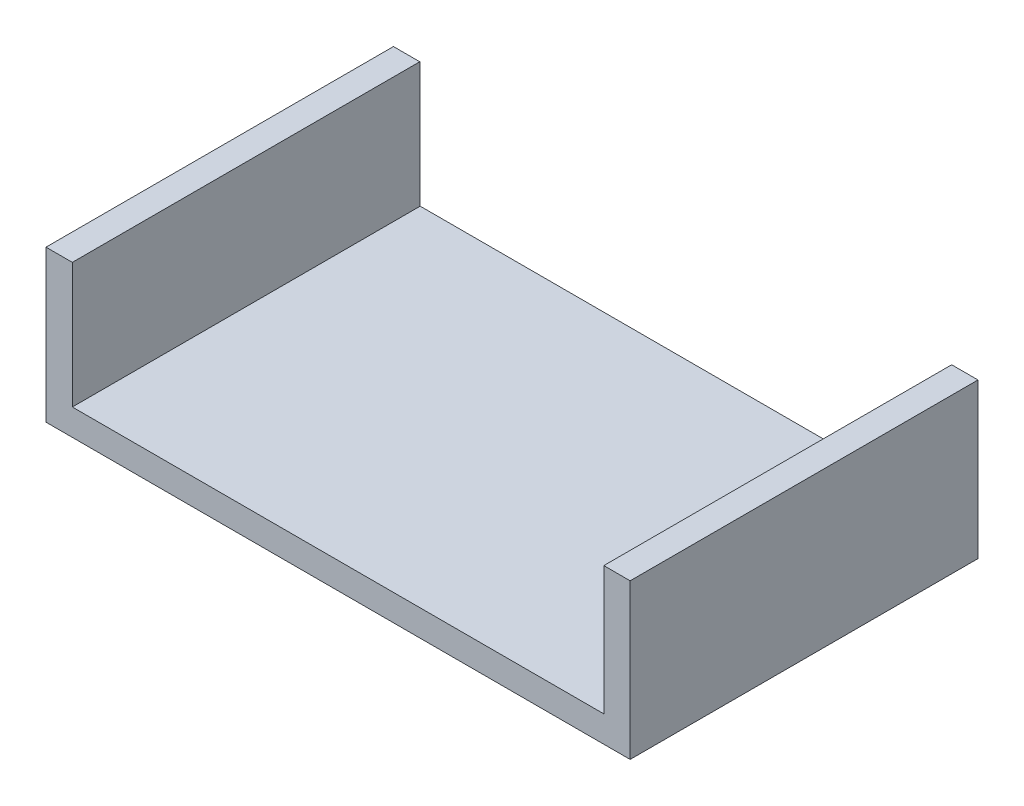
ISO-10303-21;
HEADER;
FILE_DESCRIPTION(('STEP AP214'),'2;1');
FILE_NAME('part.step','',(''),(''),'','','');
FILE_SCHEMA(('AUTOMOTIVE_DESIGN { 1 0 10303 214 1 1 1 1 }'));
ENDSEC;
DATA;
#1=APPLICATION_CONTEXT('core data for automotive mechanical design processes');
#2=APPLICATION_PROTOCOL_DEFINITION('international standard','automotive_design',2000,#1);
#3=PRODUCT_CONTEXT('',#1,'mechanical');
#4=PRODUCT('Part','Part','',(#3));
#5=PRODUCT_RELATED_PRODUCT_CATEGORY('part','',(#4));
#6=PRODUCT_DEFINITION_FORMATION('','',#4);
#7=PRODUCT_DEFINITION_CONTEXT('part definition',#1,'design');
#8=PRODUCT_DEFINITION('design','',#6,#7);
#9=PRODUCT_DEFINITION_SHAPE('','',#8);
#10=(LENGTH_UNIT() NAMED_UNIT(*) SI_UNIT(.MILLI.,.METRE.));
#11=(NAMED_UNIT(*) PLANE_ANGLE_UNIT() SI_UNIT($,.RADIAN.));
#12=(NAMED_UNIT(*) SI_UNIT($,.STERADIAN.) SOLID_ANGLE_UNIT());
#13=UNCERTAINTY_MEASURE_WITH_UNIT(LENGTH_MEASURE(1.E-05),#10,'distance_accuracy_value','');
#14=(GEOMETRIC_REPRESENTATION_CONTEXT(3) GLOBAL_UNCERTAINTY_ASSIGNED_CONTEXT((#13)) GLOBAL_UNIT_ASSIGNED_CONTEXT((#10,
#11,#12)) REPRESENTATION_CONTEXT('',''));
#15=CARTESIAN_POINT('',(0.,0.,0.));
#16=DIRECTION('',(0.,0.,1.));
#17=DIRECTION('',(1.,0.,0.));
#18=AXIS2_PLACEMENT_3D('',#15,#16,#17);
#19=CARTESIAN_POINT('',(-14.9987,1.4859,-9.81709999999999));
#20=DIRECTION('',(0.,0.,1.));
#21=DIRECTION('',(1.,0.,0.));
#22=AXIS2_PLACEMENT_3D('',#19,#20,#21);
#23=PLANE('',#22);
#24=DIRECTION('',(-1.,0.,0.));
#25=VECTOR('',#24,1.);
#26=CARTESIAN_POINT('',(-14.9987,0.,-9.81709999999999));
#27=LINE('',#26,#25);
#28=CARTESIAN_POINT('',(16.4846,0.,-9.81709999999999));
#29=VERTEX_POINT('',#28);
#30=CARTESIAN_POINT('',(-14.9987,0.,-9.81709999999999));
#31=VERTEX_POINT('',#30);
#32=EDGE_CURVE('E67',#29,#31,#27,.T.);
#33=ORIENTED_EDGE('',*,*,#32,.T.);
#34=DIRECTION('',(0.,-1.,0.));
#35=VECTOR('',#34,1.);
#36=CARTESIAN_POINT('',(-14.9987,1.4859,-9.81709999999999));
#37=LINE('',#36,#35);
#38=CARTESIAN_POINT('',(-14.9987,1.4859,-9.81709999999999));
#39=VERTEX_POINT('',#38);
#40=EDGE_CURVE('E11',#39,#31,#37,.T.);
#41=ORIENTED_EDGE('',*,*,#40,.F.);
#42=DIRECTION('',(-1.,0.,0.));
#43=VECTOR('',#42,1.);
#44=CARTESIAN_POINT('',(-14.9987,1.4859,-9.81709999999999));
#45=LINE('',#44,#43);
#46=CARTESIAN_POINT('',(14.9987,1.4859,-9.81709999999999));
#47=VERTEX_POINT('',#46);
#48=EDGE_CURVE('E56',#47,#39,#45,.T.);
#49=ORIENTED_EDGE('',*,*,#48,.F.);
#50=DIRECTION('',(0.,1.,0.));
#51=VECTOR('',#50,1.);
#52=CARTESIAN_POINT('',(14.9987,0.,-9.81709999999999));
#53=LINE('',#52,#51);
#54=CARTESIAN_POINT('',(14.9987,8.73321644030511,-9.81709999999999));
#55=VERTEX_POINT('',#54);
#56=EDGE_CURVE('E143',#47,#55,#53,.T.);
#57=ORIENTED_EDGE('',*,*,#56,.T.);
#58=DIRECTION('',(-1.,0.,0.));
#59=VECTOR('',#58,1.);
#60=CARTESIAN_POINT('',(16.4846,8.73321644030511,-9.81709999999999));
#61=LINE('',#60,#59);
#62=CARTESIAN_POINT('',(16.4846,8.73321644030511,-9.81709999999999));
#63=VERTEX_POINT('',#62);
#64=EDGE_CURVE('E154',#63,#55,#61,.T.);
#65=ORIENTED_EDGE('',*,*,#64,.F.);
#66=DIRECTION('',(0.,1.,0.));
#67=VECTOR('',#66,1.);
#68=CARTESIAN_POINT('',(16.4846,0.,-9.81709999999999));
#69=LINE('',#68,#67);
#70=EDGE_CURVE('E135',#29,#63,#69,.T.);
#71=ORIENTED_EDGE('',*,*,#70,.F.);
#72=EDGE_LOOP('',(#33,#41,#49,#57,#65,#71));
#73=FACE_BOUND('',#72,.T.);
#74=ADVANCED_FACE('F33',(#73),#23,.F.);
#75=CARTESIAN_POINT('',(-14.9987,1.4859,9.81710000000001));
#76=DIRECTION('',(1.,0.,0.));
#77=DIRECTION('',(0.,0.,-1.));
#78=AXIS2_PLACEMENT_3D('',#75,#76,#77);
#79=PLANE('',#78);
#80=DIRECTION('',(0.,0.,1.));
#81=VECTOR('',#80,1.);
#82=CARTESIAN_POINT('',(-14.9987,0.,9.81710000000001));
#83=LINE('',#82,#81);
#84=CARTESIAN_POINT('',(-14.9987,0.,-9.79369365086313));
#85=VERTEX_POINT('',#84);
#86=EDGE_CURVE('E129',#31,#85,#83,.T.);
#87=ORIENTED_EDGE('',*,*,#86,.T.);
#88=DIRECTION('',(0.,1.,0.));
#89=VECTOR('',#88,1.);
#90=CARTESIAN_POINT('',(-14.9987,0.,-9.79369365086313));
#91=LINE('',#90,#89);
#92=CARTESIAN_POINT('',(-14.9987,1.4859,-9.79369365086313));
#93=VERTEX_POINT('',#92);
#94=EDGE_CURVE('E167',#85,#93,#91,.T.);
#95=ORIENTED_EDGE('',*,*,#94,.T.);
#96=DIRECTION('',(0.,0.,1.));
#97=VECTOR('',#96,1.);
#98=CARTESIAN_POINT('',(-14.9987,1.4859,9.81710000000001));
#99=LINE('',#98,#97);
#100=EDGE_CURVE('E181',#39,#93,#99,.T.);
#101=ORIENTED_EDGE('',*,*,#100,.F.);
#102=ORIENTED_EDGE('',*,*,#40,.T.);
#103=EDGE_LOOP('',(#87,#95,#101,#102));
#104=FACE_BOUND('',#103,.T.);
#105=ADVANCED_FACE('F188',(#104),#79,.F.);
#106=CARTESIAN_POINT('',(-14.9987,1.4859,9.81710000000001));
#107=DIRECTION('',(0.,0.,-1.));
#108=DIRECTION('',(-1.,0.,0.));
#109=AXIS2_PLACEMENT_3D('',#106,#107,#108);
#110=PLANE('',#109);
#111=DIRECTION('',(1.,0.,0.));
#112=VECTOR('',#111,1.);
#113=CARTESIAN_POINT('',(-14.9987,0.,9.81710000000001));
#114=LINE('',#113,#112);
#115=CARTESIAN_POINT('',(-16.4846,0.,9.81710000000001));
#116=VERTEX_POINT('',#115);
#117=CARTESIAN_POINT('',(16.4846,0.,9.81710000000001));
#118=VERTEX_POINT('',#117);
#119=EDGE_CURVE('E117',#116,#118,#114,.T.);
#120=ORIENTED_EDGE('',*,*,#119,.T.);
#121=DIRECTION('',(0.,-1.,0.));
#122=VECTOR('',#121,1.);
#123=CARTESIAN_POINT('',(16.4846,0.,9.81710000000001));
#124=LINE('',#123,#122);
#125=CARTESIAN_POINT('',(16.4846,8.73321644030511,9.81710000000001));
#126=VERTEX_POINT('',#125);
#127=EDGE_CURVE('E122',#126,#118,#124,.T.);
#128=ORIENTED_EDGE('',*,*,#127,.F.);
#129=DIRECTION('',(-1.,0.,0.));
#130=VECTOR('',#129,1.);
#131=CARTESIAN_POINT('',(16.4846,8.73321644030511,9.81710000000001));
#132=LINE('',#131,#130);
#133=CARTESIAN_POINT('',(14.9987,8.73321644030511,9.81710000000001));
#134=VERTEX_POINT('',#133);
#135=EDGE_CURVE('E148',#126,#134,#132,.T.);
#136=ORIENTED_EDGE('',*,*,#135,.T.);
#137=DIRECTION('',(0.,-1.,0.));
#138=VECTOR('',#137,1.);
#139=CARTESIAN_POINT('',(14.9987,0.,9.81710000000001));
#140=LINE('',#139,#138);
#141=CARTESIAN_POINT('',(14.9987,1.4859,9.81710000000001));
#142=VERTEX_POINT('',#141);
#143=EDGE_CURVE('E149',#134,#142,#140,.T.);
#144=ORIENTED_EDGE('',*,*,#143,.T.);
#145=DIRECTION('',(1.,0.,0.));
#146=VECTOR('',#145,1.);
#147=CARTESIAN_POINT('',(-14.9987,1.4859,9.81710000000001));
#148=LINE('',#147,#146);
#149=CARTESIAN_POINT('',(-14.9987,1.4859,9.81710000000001));
#150=VERTEX_POINT('',#149);
#151=EDGE_CURVE('E40',#150,#142,#148,.T.);
#152=ORIENTED_EDGE('',*,*,#151,.F.);
#153=DIRECTION('',(0.,-1.,0.));
#154=VECTOR('',#153,1.);
#155=CARTESIAN_POINT('',(-14.9987,0.,9.81710000000001));
#156=LINE('',#155,#154);
#157=CARTESIAN_POINT('',(-14.9987,8.55658581990326,9.81710000000001));
#158=VERTEX_POINT('',#157);
#159=EDGE_CURVE('E73',#158,#150,#156,.T.);
#160=ORIENTED_EDGE('',*,*,#159,.F.);
#161=DIRECTION('',(1.,0.,0.));
#162=VECTOR('',#161,1.);
#163=CARTESIAN_POINT('',(-16.4846,8.55658581990326,9.81710000000001));
#164=LINE('',#163,#162);
#165=CARTESIAN_POINT('',(-16.4846,8.55658581990326,9.81710000000001));
#166=VERTEX_POINT('',#165);
#167=EDGE_CURVE('E175',#166,#158,#164,.T.);
#168=ORIENTED_EDGE('',*,*,#167,.F.);
#169=DIRECTION('',(0.,-1.,0.));
#170=VECTOR('',#169,1.);
#171=CARTESIAN_POINT('',(-16.4846,0.,9.81710000000001));
#172=LINE('',#171,#170);
#173=EDGE_CURVE('E124',#166,#116,#172,.T.);
#174=ORIENTED_EDGE('',*,*,#173,.T.);
#175=EDGE_LOOP('',(#120,#128,#136,#144,#152,#160,#168,#174));
#176=FACE_BOUND('',#175,.T.);
#177=ADVANCED_FACE('F119',(#176),#110,.F.);
#178=CARTESIAN_POINT('',(0.,1.4859,0.));
#179=DIRECTION('',(0.,-1.,0.));
#180=DIRECTION('',(0.,0.,-1.));
#181=AXIS2_PLACEMENT_3D('',#178,#179,#180);
#182=PLANE('',#181);
#183=DIRECTION('',(0.,0.,-1.));
#184=VECTOR('',#183,1.);
#185=CARTESIAN_POINT('',(14.9987,1.4859,9.81710000000001));
#186=LINE('',#185,#184);
#187=EDGE_CURVE('E128',#142,#47,#186,.T.);
#188=ORIENTED_EDGE('',*,*,#187,.T.);
#189=ORIENTED_EDGE('',*,*,#48,.T.);
#190=ORIENTED_EDGE('',*,*,#100,.T.);
#191=EDGE_CURVE('E180',#93,#150,#99,.T.);
#192=ORIENTED_EDGE('',*,*,#191,.T.);
#193=ORIENTED_EDGE('',*,*,#151,.T.);
#194=EDGE_LOOP('',(#188,#189,#190,#192,#193));
#195=FACE_BOUND('',#194,.T.);
#196=ADVANCED_FACE('F212',(#195),#182,.F.);
#197=CARTESIAN_POINT('',(0.,0.,0.));
#198=DIRECTION('',(0.,-1.,0.));
#199=DIRECTION('',(0.,0.,-1.));
#200=AXIS2_PLACEMENT_3D('',#197,#198,#199);
#201=PLANE('',#200);
#202=ORIENTED_EDGE('',*,*,#32,.F.);
#203=DIRECTION('',(0.,0.,-1.));
#204=VECTOR('',#203,1.);
#205=CARTESIAN_POINT('',(16.4846,0.,9.81710000000001));
#206=LINE('',#205,#204);
#207=EDGE_CURVE('E131',#118,#29,#206,.T.);
#208=ORIENTED_EDGE('',*,*,#207,.F.);
#209=ORIENTED_EDGE('',*,*,#119,.F.);
#210=DIRECTION('',(0.,0.,-1.));
#211=VECTOR('',#210,1.);
#212=CARTESIAN_POINT('',(-16.4846,0.,-9.79369365086313));
#213=LINE('',#212,#211);
#214=CARTESIAN_POINT('',(-16.4846,0.,-9.79369365086313));
#215=VERTEX_POINT('',#214);
#216=EDGE_CURVE('E164',#116,#215,#213,.T.);
#217=ORIENTED_EDGE('',*,*,#216,.T.);
#218=DIRECTION('',(1.,0.,0.));
#219=VECTOR('',#218,1.);
#220=CARTESIAN_POINT('',(-16.4846,0.,-9.79369365086313));
#221=LINE('',#220,#219);
#222=EDGE_CURVE('E173',#215,#85,#221,.T.);
#223=ORIENTED_EDGE('',*,*,#222,.T.);
#224=ORIENTED_EDGE('',*,*,#86,.F.);
#225=EDGE_LOOP('',(#202,#208,#209,#217,#223,#224));
#226=FACE_BOUND('',#225,.T.);
#227=ADVANCED_FACE('F132',(#226),#201,.T.);
#228=CARTESIAN_POINT('',(-14.9987,0.,0.));
#229=DIRECTION('',(1.,0.,0.));
#230=DIRECTION('',(0.,0.,-1.));
#231=AXIS2_PLACEMENT_3D('',#228,#229,#230);
#232=PLANE('',#231);
#233=ORIENTED_EDGE('',*,*,#191,.F.);
#234=CARTESIAN_POINT('',(-14.9987,8.55658581990326,-9.79369365086313));
#235=VERTEX_POINT('',#234);
#236=EDGE_CURVE('E47',#93,#235,#91,.T.);
#237=ORIENTED_EDGE('',*,*,#236,.T.);
#238=DIRECTION('',(0.,0.,1.));
#239=VECTOR('',#238,1.);
#240=CARTESIAN_POINT('',(-14.9987,8.55658581990326,-9.79369365086313));
#241=LINE('',#240,#239);
#242=EDGE_CURVE('E170',#235,#158,#241,.T.);
#243=ORIENTED_EDGE('',*,*,#242,.T.);
#244=ORIENTED_EDGE('',*,*,#159,.T.);
#245=EDGE_LOOP('',(#233,#237,#243,#244));
#246=FACE_BOUND('',#245,.T.);
#247=ADVANCED_FACE('F194',(#246),#232,.T.);
#248=CARTESIAN_POINT('',(-16.4846,0.,-9.79369365086313));
#249=DIRECTION('',(0.,0.,-1.));
#250=DIRECTION('',(-1.,0.,0.));
#251=AXIS2_PLACEMENT_3D('',#248,#249,#250);
#252=PLANE('',#251);
#253=ORIENTED_EDGE('',*,*,#94,.F.);
#254=ORIENTED_EDGE('',*,*,#222,.F.);
#255=DIRECTION('',(0.,1.,0.));
#256=VECTOR('',#255,1.);
#257=CARTESIAN_POINT('',(-16.4846,0.,-9.79369365086313));
#258=LINE('',#257,#256);
#259=CARTESIAN_POINT('',(-16.4846,8.55658581990326,-9.79369365086313));
#260=VERTEX_POINT('',#259);
#261=EDGE_CURVE('E157',#215,#260,#258,.T.);
#262=ORIENTED_EDGE('',*,*,#261,.T.);
#263=DIRECTION('',(1.,0.,0.));
#264=VECTOR('',#263,1.);
#265=CARTESIAN_POINT('',(-16.4846,8.55658581990326,-9.79369365086313));
#266=LINE('',#265,#264);
#267=EDGE_CURVE('E166',#260,#235,#266,.T.);
#268=ORIENTED_EDGE('',*,*,#267,.T.);
#269=ORIENTED_EDGE('',*,*,#236,.F.);
#270=EDGE_LOOP('',(#253,#254,#262,#268,#269));
#271=FACE_BOUND('',#270,.T.);
#272=ADVANCED_FACE('F191',(#271),#252,.T.);
#273=CARTESIAN_POINT('',(-16.4846,8.55658581990326,-9.79369365086313));
#274=DIRECTION('',(0.,1.,0.));
#275=DIRECTION('',(0.,0.,1.));
#276=AXIS2_PLACEMENT_3D('',#273,#274,#275);
#277=PLANE('',#276);
#278=ORIENTED_EDGE('',*,*,#242,.F.);
#279=ORIENTED_EDGE('',*,*,#267,.F.);
#280=DIRECTION('',(0.,0.,1.));
#281=VECTOR('',#280,1.);
#282=CARTESIAN_POINT('',(-16.4846,8.55658581990326,-9.79369365086313));
#283=LINE('',#282,#281);
#284=EDGE_CURVE('E160',#260,#166,#283,.T.);
#285=ORIENTED_EDGE('',*,*,#284,.T.);
#286=ORIENTED_EDGE('',*,*,#167,.T.);
#287=EDGE_LOOP('',(#278,#279,#285,#286));
#288=FACE_BOUND('',#287,.T.);
#289=ADVANCED_FACE('F193',(#288),#277,.T.);
#290=CARTESIAN_POINT('',(-16.4846,0.,0.));
#291=DIRECTION('',(1.,0.,0.));
#292=DIRECTION('',(0.,0.,-1.));
#293=AXIS2_PLACEMENT_3D('',#290,#291,#292);
#294=PLANE('',#293);
#295=ORIENTED_EDGE('',*,*,#261,.F.);
#296=ORIENTED_EDGE('',*,*,#216,.F.);
#297=ORIENTED_EDGE('',*,*,#173,.F.);
#298=ORIENTED_EDGE('',*,*,#284,.F.);
#299=EDGE_LOOP('',(#295,#296,#297,#298));
#300=FACE_BOUND('',#299,.T.);
#301=ADVANCED_FACE('F200',(#300),#294,.F.);
#302=CARTESIAN_POINT('',(14.9987,0.,0.));
#303=DIRECTION('',(-1.,0.,0.));
#304=DIRECTION('',(0.,0.,1.));
#305=AXIS2_PLACEMENT_3D('',#302,#303,#304);
#306=PLANE('',#305);
#307=ORIENTED_EDGE('',*,*,#187,.F.);
#308=ORIENTED_EDGE('',*,*,#143,.F.);
#309=DIRECTION('',(0.,0.,1.));
#310=VECTOR('',#309,1.);
#311=CARTESIAN_POINT('',(14.9987,8.73321644030511,9.81710000000001));
#312=LINE('',#311,#310);
#313=EDGE_CURVE('E141',#55,#134,#312,.T.);
#314=ORIENTED_EDGE('',*,*,#313,.F.);
#315=ORIENTED_EDGE('',*,*,#56,.F.);
#316=EDGE_LOOP('',(#307,#308,#314,#315));
#317=FACE_BOUND('',#316,.T.);
#318=ADVANCED_FACE('F222',(#317),#306,.T.);
#319=CARTESIAN_POINT('',(16.4846,8.73321644030511,9.81710000000001));
#320=DIRECTION('',(0.,-1.,0.));
#321=DIRECTION('',(0.,0.,-1.));
#322=AXIS2_PLACEMENT_3D('',#319,#320,#321);
#323=PLANE('',#322);
#324=ORIENTED_EDGE('',*,*,#313,.T.);
#325=ORIENTED_EDGE('',*,*,#135,.F.);
#326=DIRECTION('',(0.,0.,1.));
#327=VECTOR('',#326,1.);
#328=CARTESIAN_POINT('',(16.4846,8.73321644030511,9.81710000000001));
#329=LINE('',#328,#327);
#330=EDGE_CURVE('E139',#63,#126,#329,.T.);
#331=ORIENTED_EDGE('',*,*,#330,.F.);
#332=ORIENTED_EDGE('',*,*,#64,.T.);
#333=EDGE_LOOP('',(#324,#325,#331,#332));
#334=FACE_BOUND('',#333,.T.);
#335=ADVANCED_FACE('F225',(#334),#323,.F.);
#336=CARTESIAN_POINT('',(16.4846,0.,0.));
#337=DIRECTION('',(-1.,0.,0.));
#338=DIRECTION('',(0.,0.,1.));
#339=AXIS2_PLACEMENT_3D('',#336,#337,#338);
#340=PLANE('',#339);
#341=ORIENTED_EDGE('',*,*,#127,.T.);
#342=ORIENTED_EDGE('',*,*,#207,.T.);
#343=ORIENTED_EDGE('',*,*,#70,.T.);
#344=ORIENTED_EDGE('',*,*,#330,.T.);
#345=EDGE_LOOP('',(#341,#342,#343,#344));
#346=FACE_BOUND('',#345,.T.);
#347=ADVANCED_FACE('F137',(#346),#340,.F.);
#348=CLOSED_SHELL('',(#74,#105,#177,#196,#227,#247,#272,#289,#301,#318,#335,#347));
#349=MANIFOLD_SOLID_BREP('B2',#348);
#350=ADVANCED_BREP_SHAPE_REPRESENTATION('',(#18,#349),#14);
#351=SHAPE_DEFINITION_REPRESENTATION(#9,#350);
ENDSEC;
END-ISO-10303-21;
